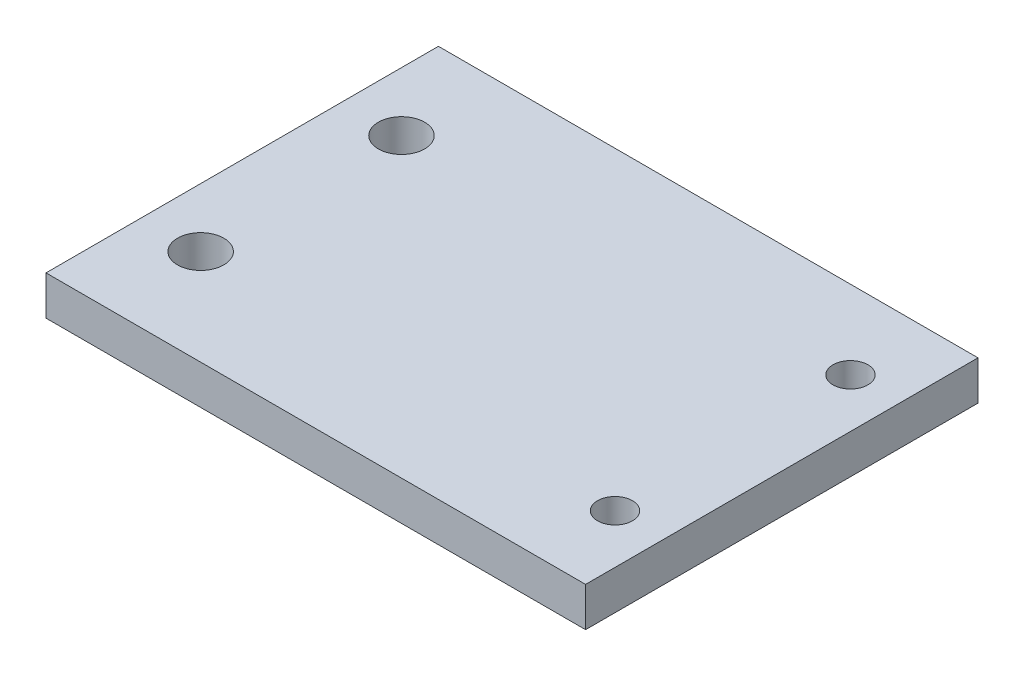
ISO-10303-21;
HEADER;
FILE_DESCRIPTION(('STEP AP214'),'2;1');
FILE_NAME('part.step','',(''),(''),'','','');
FILE_SCHEMA(('AUTOMOTIVE_DESIGN { 1 0 10303 214 1 1 1 1 }'));
ENDSEC;
DATA;
#1=APPLICATION_CONTEXT('core data for automotive mechanical design processes');
#2=APPLICATION_PROTOCOL_DEFINITION('international standard','automotive_design',2000,#1);
#3=PRODUCT_CONTEXT('',#1,'mechanical');
#4=PRODUCT('Part','Part','',(#3));
#5=PRODUCT_RELATED_PRODUCT_CATEGORY('part','',(#4));
#6=PRODUCT_DEFINITION_FORMATION('','',#4);
#7=PRODUCT_DEFINITION_CONTEXT('part definition',#1,'design');
#8=PRODUCT_DEFINITION('design','',#6,#7);
#9=PRODUCT_DEFINITION_SHAPE('','',#8);
#10=(LENGTH_UNIT() NAMED_UNIT(*) SI_UNIT(.MILLI.,.METRE.));
#11=(NAMED_UNIT(*) PLANE_ANGLE_UNIT() SI_UNIT($,.RADIAN.));
#12=(NAMED_UNIT(*) SI_UNIT($,.STERADIAN.) SOLID_ANGLE_UNIT());
#13=UNCERTAINTY_MEASURE_WITH_UNIT(LENGTH_MEASURE(1.E-05),#10,'distance_accuracy_value','');
#14=(GEOMETRIC_REPRESENTATION_CONTEXT(3) GLOBAL_UNCERTAINTY_ASSIGNED_CONTEXT((#13)) GLOBAL_UNIT_ASSIGNED_CONTEXT((#10,
#11,#12)) REPRESENTATION_CONTEXT('',''));
#15=CARTESIAN_POINT('',(0.,0.,0.));
#16=DIRECTION('',(0.,0.,1.));
#17=DIRECTION('',(1.,0.,0.));
#18=AXIS2_PLACEMENT_3D('',#15,#16,#17);
#19=CARTESIAN_POINT('',(0.,2.54,0.));
#20=DIRECTION('',(1.,0.,0.));
#21=DIRECTION('',(0.,0.,-1.));
#22=AXIS2_PLACEMENT_3D('',#19,#20,#21);
#23=PLANE('',#22);
#24=DIRECTION('',(0.,0.,1.));
#25=VECTOR('',#24,1.);
#26=CARTESIAN_POINT('',(0.,0.,0.));
#27=LINE('',#26,#25);
#28=CARTESIAN_POINT('',(0.,0.,-25.4));
#29=VERTEX_POINT('',#28);
#30=CARTESIAN_POINT('',(0.,0.,0.));
#31=VERTEX_POINT('',#30);
#32=EDGE_CURVE('E95',#29,#31,#27,.T.);
#33=ORIENTED_EDGE('',*,*,#32,.T.);
#34=DIRECTION('',(0.,-1.,0.));
#35=VECTOR('',#34,1.);
#36=CARTESIAN_POINT('',(0.,2.54,0.));
#37=LINE('',#36,#35);
#38=CARTESIAN_POINT('',(0.,2.54,0.));
#39=VERTEX_POINT('',#38);
#40=EDGE_CURVE('E11',#39,#31,#37,.T.);
#41=ORIENTED_EDGE('',*,*,#40,.F.);
#42=DIRECTION('',(0.,0.,1.));
#43=VECTOR('',#42,1.);
#44=CARTESIAN_POINT('',(0.,2.54,0.));
#45=LINE('',#44,#43);
#46=CARTESIAN_POINT('',(0.,2.54,-25.4));
#47=VERTEX_POINT('',#46);
#48=EDGE_CURVE('E83',#47,#39,#45,.T.);
#49=ORIENTED_EDGE('',*,*,#48,.F.);
#50=DIRECTION('',(0.,-1.,0.));
#51=VECTOR('',#50,1.);
#52=CARTESIAN_POINT('',(0.,2.54,-25.4));
#53=LINE('',#52,#51);
#54=EDGE_CURVE('E91',#47,#29,#53,.T.);
#55=ORIENTED_EDGE('',*,*,#54,.T.);
#56=EDGE_LOOP('',(#33,#41,#49,#55));
#57=FACE_BOUND('',#56,.T.);
#58=ADVANCED_FACE('F32',(#57),#23,.F.);
#59=CARTESIAN_POINT('',(0.,2.54,0.));
#60=DIRECTION('',(0.,0.,-1.));
#61=DIRECTION('',(-1.,0.,0.));
#62=AXIS2_PLACEMENT_3D('',#59,#60,#61);
#63=PLANE('',#62);
#64=DIRECTION('',(1.,0.,0.));
#65=VECTOR('',#64,1.);
#66=CARTESIAN_POINT('',(0.,0.,0.));
#67=LINE('',#66,#65);
#68=CARTESIAN_POINT('',(34.925,0.,0.));
#69=VERTEX_POINT('',#68);
#70=EDGE_CURVE('E87',#31,#69,#67,.T.);
#71=ORIENTED_EDGE('',*,*,#70,.T.);
#72=DIRECTION('',(0.,-1.,0.));
#73=VECTOR('',#72,1.);
#74=CARTESIAN_POINT('',(34.925,2.54,0.));
#75=LINE('',#74,#73);
#76=CARTESIAN_POINT('',(34.925,2.54,0.));
#77=VERTEX_POINT('',#76);
#78=EDGE_CURVE('E40',#77,#69,#75,.T.);
#79=ORIENTED_EDGE('',*,*,#78,.F.);
#80=DIRECTION('',(1.,0.,0.));
#81=VECTOR('',#80,1.);
#82=CARTESIAN_POINT('',(0.,2.54,0.));
#83=LINE('',#82,#81);
#84=EDGE_CURVE('E78',#39,#77,#83,.T.);
#85=ORIENTED_EDGE('',*,*,#84,.F.);
#86=ORIENTED_EDGE('',*,*,#40,.T.);
#87=EDGE_LOOP('',(#71,#79,#85,#86));
#88=FACE_BOUND('',#87,.T.);
#89=ADVANCED_FACE('F86',(#88),#63,.F.);
#90=CARTESIAN_POINT('',(34.925,2.54,0.));
#91=DIRECTION('',(-1.,0.,0.));
#92=DIRECTION('',(0.,0.,1.));
#93=AXIS2_PLACEMENT_3D('',#90,#91,#92);
#94=PLANE('',#93);
#95=DIRECTION('',(0.,0.,-1.));
#96=VECTOR('',#95,1.);
#97=CARTESIAN_POINT('',(34.925,0.,0.));
#98=LINE('',#97,#96);
#99=CARTESIAN_POINT('',(34.925,0.,-25.4));
#100=VERTEX_POINT('',#99);
#101=EDGE_CURVE('E65',#69,#100,#98,.T.);
#102=ORIENTED_EDGE('',*,*,#101,.T.);
#103=DIRECTION('',(0.,-1.,0.));
#104=VECTOR('',#103,1.);
#105=CARTESIAN_POINT('',(34.925,2.54,-25.4));
#106=LINE('',#105,#104);
#107=CARTESIAN_POINT('',(34.925,2.54,-25.4));
#108=VERTEX_POINT('',#107);
#109=EDGE_CURVE('E88',#108,#100,#106,.T.);
#110=ORIENTED_EDGE('',*,*,#109,.F.);
#111=DIRECTION('',(0.,0.,-1.));
#112=VECTOR('',#111,1.);
#113=CARTESIAN_POINT('',(34.925,2.54,0.));
#114=LINE('',#113,#112);
#115=EDGE_CURVE('E81',#77,#108,#114,.T.);
#116=ORIENTED_EDGE('',*,*,#115,.F.);
#117=ORIENTED_EDGE('',*,*,#78,.T.);
#118=EDGE_LOOP('',(#102,#110,#116,#117));
#119=FACE_BOUND('',#118,.T.);
#120=ADVANCED_FACE('F89',(#119),#94,.F.);
#121=CARTESIAN_POINT('',(0.,2.54,-25.4));
#122=DIRECTION('',(0.,0.,1.));
#123=DIRECTION('',(1.,0.,0.));
#124=AXIS2_PLACEMENT_3D('',#121,#122,#123);
#125=PLANE('',#124);
#126=DIRECTION('',(-1.,0.,0.));
#127=VECTOR('',#126,1.);
#128=CARTESIAN_POINT('',(0.,0.,-25.4));
#129=LINE('',#128,#127);
#130=EDGE_CURVE('E71',#100,#29,#129,.T.);
#131=ORIENTED_EDGE('',*,*,#130,.T.);
#132=ORIENTED_EDGE('',*,*,#54,.F.);
#133=DIRECTION('',(-1.,0.,0.));
#134=VECTOR('',#133,1.);
#135=CARTESIAN_POINT('',(0.,2.54,-25.4));
#136=LINE('',#135,#134);
#137=EDGE_CURVE('E48',#108,#47,#136,.T.);
#138=ORIENTED_EDGE('',*,*,#137,.F.);
#139=ORIENTED_EDGE('',*,*,#109,.T.);
#140=EDGE_LOOP('',(#131,#132,#138,#139));
#141=FACE_BOUND('',#140,.T.);
#142=ADVANCED_FACE('F103',(#141),#125,.F.);
#143=CARTESIAN_POINT('',(0.,2.54,0.));
#144=DIRECTION('',(0.,-1.,0.));
#145=DIRECTION('',(0.,0.,-1.));
#146=AXIS2_PLACEMENT_3D('',#143,#144,#145);
#147=PLANE('',#146);
#148=CARTESIAN_POINT('',(31.75,2.54,-20.32));
#149=DIRECTION('',(0.,1.,0.));
#150=DIRECTION('',(0.,0.,1.));
#151=AXIS2_PLACEMENT_3D('',#148,#149,#150);
#152=CIRCLE('',#151,1.1303);
#153=CARTESIAN_POINT('',(31.75,2.54,-19.1897));
#154=VERTEX_POINT('',#153);
#155=EDGE_CURVE('E127',#154,#154,#152,.T.);
#156=ORIENTED_EDGE('',*,*,#155,.F.);
#157=EDGE_LOOP('',(#156));
#158=FACE_BOUND('',#157,.T.);
#159=CARTESIAN_POINT('',(31.75,2.54,-5.08));
#160=DIRECTION('',(0.,1.,0.));
#161=DIRECTION('',(0.,0.,-1.));
#162=AXIS2_PLACEMENT_3D('',#159,#160,#161);
#163=CIRCLE('',#162,1.1303);
#164=CARTESIAN_POINT('',(31.75,2.54,-6.2103));
#165=VERTEX_POINT('',#164);
#166=EDGE_CURVE('E121',#165,#165,#163,.T.);
#167=ORIENTED_EDGE('',*,*,#166,.F.);
#168=EDGE_LOOP('',(#167));
#169=FACE_BOUND('',#168,.T.);
#170=CARTESIAN_POINT('',(3.81,2.54,-19.2));
#171=DIRECTION('',(0.,-1.,0.));
#172=DIRECTION('',(0.,0.,-1.));
#173=AXIS2_PLACEMENT_3D('',#170,#171,#172);
#174=CIRCLE('',#173,1.5);
#175=CARTESIAN_POINT('',(3.81,2.54,-20.7));
#176=VERTEX_POINT('',#175);
#177=EDGE_CURVE('E98',#176,#176,#174,.F.);
#178=ORIENTED_EDGE('',*,*,#177,.F.);
#179=EDGE_LOOP('',(#178));
#180=FACE_BOUND('',#179,.T.);
#181=CARTESIAN_POINT('',(3.81,2.54,-6.2));
#182=DIRECTION('',(0.,-1.,0.));
#183=DIRECTION('',(0.,0.,-1.));
#184=AXIS2_PLACEMENT_3D('',#181,#182,#183);
#185=CIRCLE('',#184,1.5);
#186=CARTESIAN_POINT('',(3.81,2.54,-7.7));
#187=VERTEX_POINT('',#186);
#188=EDGE_CURVE('E111',#187,#187,#185,.F.);
#189=ORIENTED_EDGE('',*,*,#188,.F.);
#190=EDGE_LOOP('',(#189));
#191=FACE_BOUND('',#190,.T.);
#192=ORIENTED_EDGE('',*,*,#48,.T.);
#193=ORIENTED_EDGE('',*,*,#84,.T.);
#194=ORIENTED_EDGE('',*,*,#115,.T.);
#195=ORIENTED_EDGE('',*,*,#137,.T.);
#196=EDGE_LOOP('',(#192,#193,#194,#195));
#197=FACE_BOUND('',#196,.T.);
#198=ADVANCED_FACE('F79',(#158,#169,#180,#191,#197),#147,.F.);
#199=CARTESIAN_POINT('',(0.,0.,0.));
#200=DIRECTION('',(0.,-1.,0.));
#201=DIRECTION('',(0.,0.,-1.));
#202=AXIS2_PLACEMENT_3D('',#199,#200,#201);
#203=PLANE('',#202);
#204=CARTESIAN_POINT('',(31.75,0.,-20.32));
#205=DIRECTION('',(0.,1.,0.));
#206=DIRECTION('',(0.,0.,1.));
#207=AXIS2_PLACEMENT_3D('',#204,#205,#206);
#208=CIRCLE('',#207,1.1303);
#209=CARTESIAN_POINT('',(31.75,0.,-19.1897));
#210=VERTEX_POINT('',#209);
#211=EDGE_CURVE('E118',#210,#210,#208,.T.);
#212=ORIENTED_EDGE('',*,*,#211,.T.);
#213=EDGE_LOOP('',(#212));
#214=FACE_BOUND('',#213,.T.);
#215=CARTESIAN_POINT('',(31.75,0.,-5.08));
#216=DIRECTION('',(0.,1.,0.));
#217=DIRECTION('',(0.,0.,-1.));
#218=AXIS2_PLACEMENT_3D('',#215,#216,#217);
#219=CIRCLE('',#218,1.1303);
#220=CARTESIAN_POINT('',(31.75,0.,-6.2103));
#221=VERTEX_POINT('',#220);
#222=EDGE_CURVE('E124',#221,#221,#219,.T.);
#223=ORIENTED_EDGE('',*,*,#222,.T.);
#224=EDGE_LOOP('',(#223));
#225=FACE_BOUND('',#224,.T.);
#226=CARTESIAN_POINT('',(3.81,0.,-19.2));
#227=DIRECTION('',(0.,1.,0.));
#228=DIRECTION('',(0.,0.,1.));
#229=AXIS2_PLACEMENT_3D('',#226,#227,#228);
#230=CIRCLE('',#229,1.5);
#231=CARTESIAN_POINT('',(3.81,0.,-20.7));
#232=VERTEX_POINT('',#231);
#233=EDGE_CURVE('E114',#232,#232,#230,.T.);
#234=ORIENTED_EDGE('',*,*,#233,.T.);
#235=EDGE_LOOP('',(#234));
#236=FACE_BOUND('',#235,.T.);
#237=CARTESIAN_POINT('',(3.81,0.,-6.2));
#238=DIRECTION('',(0.,1.,0.));
#239=DIRECTION('',(0.,0.,-1.));
#240=AXIS2_PLACEMENT_3D('',#237,#238,#239);
#241=CIRCLE('',#240,1.5);
#242=CARTESIAN_POINT('',(3.81,0.,-7.7));
#243=VERTEX_POINT('',#242);
#244=EDGE_CURVE('E115',#243,#243,#241,.T.);
#245=ORIENTED_EDGE('',*,*,#244,.T.);
#246=EDGE_LOOP('',(#245));
#247=FACE_BOUND('',#246,.T.);
#248=ORIENTED_EDGE('',*,*,#32,.F.);
#249=ORIENTED_EDGE('',*,*,#130,.F.);
#250=ORIENTED_EDGE('',*,*,#101,.F.);
#251=ORIENTED_EDGE('',*,*,#70,.F.);
#252=EDGE_LOOP('',(#248,#249,#250,#251));
#253=FACE_BOUND('',#252,.T.);
#254=ADVANCED_FACE('F106',(#214,#225,#236,#247,#253),#203,.T.);
#255=CARTESIAN_POINT('',(3.81,2.540012,-6.2));
#256=DIRECTION('',(0.,-1.,0.));
#257=DIRECTION('',(0.,0.,-1.));
#258=AXIS2_PLACEMENT_3D('',#255,#256,#257);
#259=CYLINDRICAL_SURFACE('',#258,1.5);
#260=CARTESIAN_POINT('',(3.81,0.,-7.7));
#261=CARTESIAN_POINT('',(3.81,0.0264583333333329,-7.7));
#262=CARTESIAN_POINT('',(3.81,0.0529166666666662,-7.7));
#263=CARTESIAN_POINT('',(3.81,0.105833333333333,-7.7));
#264=CARTESIAN_POINT('',(3.81,0.132291666666666,-7.7));
#265=CARTESIAN_POINT('',(3.81,0.185208333333333,-7.7));
#266=CARTESIAN_POINT('',(3.81,0.211666666666666,-7.7));
#267=CARTESIAN_POINT('',(3.81,0.264583333333333,-7.7));
#268=CARTESIAN_POINT('',(3.81,0.291041666666666,-7.7));
#269=CARTESIAN_POINT('',(3.81,0.343958333333333,-7.7));
#270=CARTESIAN_POINT('',(3.81,0.370416666666666,-7.7));
#271=CARTESIAN_POINT('',(3.81,0.423333333333333,-7.7));
#272=CARTESIAN_POINT('',(3.81,0.449791666666666,-7.7));
#273=CARTESIAN_POINT('',(3.81,0.502708333333333,-7.7));
#274=CARTESIAN_POINT('',(3.81,0.529166666666666,-7.7));
#275=CARTESIAN_POINT('',(3.81,0.582083333333333,-7.7));
#276=CARTESIAN_POINT('',(3.81,0.608541666666666,-7.7));
#277=CARTESIAN_POINT('',(3.81,0.661458333333333,-7.7));
#278=CARTESIAN_POINT('',(3.81,0.687916666666666,-7.7));
#279=CARTESIAN_POINT('',(3.81,0.740833333333333,-7.7));
#280=CARTESIAN_POINT('',(3.81,0.767291666666666,-7.7));
#281=CARTESIAN_POINT('',(3.81,0.820208333333333,-7.7));
#282=CARTESIAN_POINT('',(3.81,0.846666666666666,-7.7));
#283=CARTESIAN_POINT('',(3.81,0.899583333333333,-7.7));
#284=CARTESIAN_POINT('',(3.81,0.926041666666666,-7.7));
#285=CARTESIAN_POINT('',(3.81,0.978958333333333,-7.7));
#286=CARTESIAN_POINT('',(3.81,1.00541666666667,-7.7));
#287=CARTESIAN_POINT('',(3.81,1.05833333333333,-7.7));
#288=CARTESIAN_POINT('',(3.81,1.08479166666667,-7.7));
#289=CARTESIAN_POINT('',(3.81,1.13770833333333,-7.7));
#290=CARTESIAN_POINT('',(3.81,1.16416666666667,-7.7));
#291=CARTESIAN_POINT('',(3.81,1.21708333333333,-7.7));
#292=CARTESIAN_POINT('',(3.81,1.24354166666667,-7.7));
#293=CARTESIAN_POINT('',(3.81,1.29645833333333,-7.7));
#294=CARTESIAN_POINT('',(3.81,1.32291666666667,-7.7));
#295=CARTESIAN_POINT('',(3.81,1.37583333333333,-7.7));
#296=CARTESIAN_POINT('',(3.81,1.40229166666667,-7.7));
#297=CARTESIAN_POINT('',(3.81,1.45520833333333,-7.7));
#298=CARTESIAN_POINT('',(3.81,1.48166666666667,-7.7));
#299=CARTESIAN_POINT('',(3.81,1.53458333333333,-7.7));
#300=CARTESIAN_POINT('',(3.81,1.56104166666667,-7.7));
#301=CARTESIAN_POINT('',(3.81,1.61395833333333,-7.7));
#302=CARTESIAN_POINT('',(3.81,1.64041666666667,-7.7));
#303=CARTESIAN_POINT('',(3.81,1.69333333333333,-7.7));
#304=CARTESIAN_POINT('',(3.81,1.71979166666667,-7.7));
#305=CARTESIAN_POINT('',(3.81,1.77270833333333,-7.7));
#306=CARTESIAN_POINT('',(3.81,1.79916666666667,-7.7));
#307=CARTESIAN_POINT('',(3.81,1.85208333333333,-7.7));
#308=CARTESIAN_POINT('',(3.81,1.87854166666667,-7.7));
#309=CARTESIAN_POINT('',(3.81,1.93145833333333,-7.7));
#310=CARTESIAN_POINT('',(3.81,1.95791666666667,-7.7));
#311=CARTESIAN_POINT('',(3.81,2.01083333333333,-7.7));
#312=CARTESIAN_POINT('',(3.81,2.03729166666667,-7.7));
#313=CARTESIAN_POINT('',(3.81,2.09020833333333,-7.7));
#314=CARTESIAN_POINT('',(3.81,2.11666666666667,-7.7));
#315=CARTESIAN_POINT('',(3.81,2.16958333333333,-7.7));
#316=CARTESIAN_POINT('',(3.81,2.19604166666667,-7.7));
#317=CARTESIAN_POINT('',(3.81,2.24895833333333,-7.7));
#318=CARTESIAN_POINT('',(3.81,2.27541666666667,-7.7));
#319=CARTESIAN_POINT('',(3.81,2.32833333333333,-7.7));
#320=CARTESIAN_POINT('',(3.81,2.35479166666667,-7.7));
#321=CARTESIAN_POINT('',(3.81,2.40770833333333,-7.7));
#322=CARTESIAN_POINT('',(3.81,2.43416666666667,-7.7));
#323=CARTESIAN_POINT('',(3.81,2.48708333333333,-7.7));
#324=CARTESIAN_POINT('',(3.81,2.51354166666667,-7.7));
#325=CARTESIAN_POINT('',(3.81,2.54,-7.7));
#326=B_SPLINE_CURVE_WITH_KNOTS('',3,(#260,#261,#262,#263,#264,#265,#266,#267,#268,#269,#270,
#271,#272,#273,#274,#275,#276,#277,#278,#279,#280,#281,#282,#283,#284,#285,#286,#287,#288,#289,
#290,#291,#292,#293,#294,#295,#296,#297,#298,#299,#300,#301,#302,#303,#304,#305,#306,#307,#308,
#309,#310,#311,#312,#313,#314,#315,#316,#317,#318,#319,#320,#321,#322,#323,#324,#325),
.UNSPECIFIED.,.F.,.F.,(4,2,2,2,2,2,2,2,2,2,2,2,2,2,2,2,2,2,2,2,2,2,2,2,2,2,2,2,2,2,2,2,4),(0.,
0.079375,0.15875,0.238125,0.3175,0.396875,0.47625,0.555625,0.635,0.714375,0.79375,0.873125,
0.9525,1.031875,1.11125,1.190625,1.27,1.349375,1.42875,1.508125,1.5875,1.666875,1.74625,
1.825625,1.905,1.984375,2.06375,2.143125,2.2225,2.301875,2.38125,2.460625,2.54),.UNSPECIFIED.);
#327=EDGE_CURVE('BSEAM151',#243,#187,#326,.T.);
#328=ORIENTED_EDGE('',*,*,#244,.F.);
#329=ORIENTED_EDGE('',*,*,#188,.T.);
#330=ORIENTED_EDGE('',*,*,#327,.T.);
#331=ORIENTED_EDGE('',*,*,#327,.F.);
#332=EDGE_LOOP('',(#328,#330,#329,#331));
#333=FACE_BOUND('',#332,.T.);
#334=ADVANCED_FACE('F151',(#333),#259,.F.);
#335=CARTESIAN_POINT('',(3.81,2.540012,-19.2));
#336=DIRECTION('',(0.,-1.,0.));
#337=DIRECTION('',(0.,0.,-1.));
#338=AXIS2_PLACEMENT_3D('',#335,#336,#337);
#339=CYLINDRICAL_SURFACE('',#338,1.5);
#340=CARTESIAN_POINT('',(3.81,0.,-20.7));
#341=CARTESIAN_POINT('',(3.81,0.0264583333333329,-20.7));
#342=CARTESIAN_POINT('',(3.81,0.0529166666666662,-20.7));
#343=CARTESIAN_POINT('',(3.81,0.105833333333333,-20.7));
#344=CARTESIAN_POINT('',(3.81,0.132291666666666,-20.7));
#345=CARTESIAN_POINT('',(3.81,0.185208333333333,-20.7));
#346=CARTESIAN_POINT('',(3.81,0.211666666666666,-20.7));
#347=CARTESIAN_POINT('',(3.81,0.264583333333333,-20.7));
#348=CARTESIAN_POINT('',(3.81,0.291041666666666,-20.7));
#349=CARTESIAN_POINT('',(3.81,0.343958333333333,-20.7));
#350=CARTESIAN_POINT('',(3.81,0.370416666666666,-20.7));
#351=CARTESIAN_POINT('',(3.81,0.423333333333333,-20.7));
#352=CARTESIAN_POINT('',(3.81,0.449791666666666,-20.7));
#353=CARTESIAN_POINT('',(3.81,0.502708333333333,-20.7));
#354=CARTESIAN_POINT('',(3.81,0.529166666666666,-20.7));
#355=CARTESIAN_POINT('',(3.81,0.582083333333333,-20.7));
#356=CARTESIAN_POINT('',(3.81,0.608541666666666,-20.7));
#357=CARTESIAN_POINT('',(3.81,0.661458333333333,-20.7));
#358=CARTESIAN_POINT('',(3.81,0.687916666666666,-20.7));
#359=CARTESIAN_POINT('',(3.81,0.740833333333333,-20.7));
#360=CARTESIAN_POINT('',(3.81,0.767291666666666,-20.7));
#361=CARTESIAN_POINT('',(3.81,0.820208333333333,-20.7));
#362=CARTESIAN_POINT('',(3.81,0.846666666666666,-20.7));
#363=CARTESIAN_POINT('',(3.81,0.899583333333333,-20.7));
#364=CARTESIAN_POINT('',(3.81,0.926041666666666,-20.7));
#365=CARTESIAN_POINT('',(3.81,0.978958333333333,-20.7));
#366=CARTESIAN_POINT('',(3.81,1.00541666666667,-20.7));
#367=CARTESIAN_POINT('',(3.81,1.05833333333333,-20.7));
#368=CARTESIAN_POINT('',(3.81,1.08479166666667,-20.7));
#369=CARTESIAN_POINT('',(3.81,1.13770833333333,-20.7));
#370=CARTESIAN_POINT('',(3.81,1.16416666666667,-20.7));
#371=CARTESIAN_POINT('',(3.81,1.21708333333333,-20.7));
#372=CARTESIAN_POINT('',(3.81,1.24354166666667,-20.7));
#373=CARTESIAN_POINT('',(3.81,1.29645833333333,-20.7));
#374=CARTESIAN_POINT('',(3.81,1.32291666666667,-20.7));
#375=CARTESIAN_POINT('',(3.81,1.37583333333333,-20.7));
#376=CARTESIAN_POINT('',(3.81,1.40229166666667,-20.7));
#377=CARTESIAN_POINT('',(3.81,1.45520833333333,-20.7));
#378=CARTESIAN_POINT('',(3.81,1.48166666666667,-20.7));
#379=CARTESIAN_POINT('',(3.81,1.53458333333333,-20.7));
#380=CARTESIAN_POINT('',(3.81,1.56104166666667,-20.7));
#381=CARTESIAN_POINT('',(3.81,1.61395833333333,-20.7));
#382=CARTESIAN_POINT('',(3.81,1.64041666666667,-20.7));
#383=CARTESIAN_POINT('',(3.81,1.69333333333333,-20.7));
#384=CARTESIAN_POINT('',(3.81,1.71979166666667,-20.7));
#385=CARTESIAN_POINT('',(3.81,1.77270833333333,-20.7));
#386=CARTESIAN_POINT('',(3.81,1.79916666666667,-20.7));
#387=CARTESIAN_POINT('',(3.81,1.85208333333333,-20.7));
#388=CARTESIAN_POINT('',(3.81,1.87854166666667,-20.7));
#389=CARTESIAN_POINT('',(3.81,1.93145833333333,-20.7));
#390=CARTESIAN_POINT('',(3.81,1.95791666666667,-20.7));
#391=CARTESIAN_POINT('',(3.81,2.01083333333333,-20.7));
#392=CARTESIAN_POINT('',(3.81,2.03729166666667,-20.7));
#393=CARTESIAN_POINT('',(3.81,2.09020833333333,-20.7));
#394=CARTESIAN_POINT('',(3.81,2.11666666666667,-20.7));
#395=CARTESIAN_POINT('',(3.81,2.16958333333333,-20.7));
#396=CARTESIAN_POINT('',(3.81,2.19604166666667,-20.7));
#397=CARTESIAN_POINT('',(3.81,2.24895833333333,-20.7));
#398=CARTESIAN_POINT('',(3.81,2.27541666666667,-20.7));
#399=CARTESIAN_POINT('',(3.81,2.32833333333333,-20.7));
#400=CARTESIAN_POINT('',(3.81,2.35479166666667,-20.7));
#401=CARTESIAN_POINT('',(3.81,2.40770833333333,-20.7));
#402=CARTESIAN_POINT('',(3.81,2.43416666666667,-20.7));
#403=CARTESIAN_POINT('',(3.81,2.48708333333333,-20.7));
#404=CARTESIAN_POINT('',(3.81,2.51354166666667,-20.7));
#405=CARTESIAN_POINT('',(3.81,2.54,-20.7));
#406=B_SPLINE_CURVE_WITH_KNOTS('',3,(#340,#341,#342,#343,#344,#345,#346,#347,#348,#349,#350,
#351,#352,#353,#354,#355,#356,#357,#358,#359,#360,#361,#362,#363,#364,#365,#366,#367,#368,#369,
#370,#371,#372,#373,#374,#375,#376,#377,#378,#379,#380,#381,#382,#383,#384,#385,#386,#387,#388,
#389,#390,#391,#392,#393,#394,#395,#396,#397,#398,#399,#400,#401,#402,#403,#404,#405),
.UNSPECIFIED.,.F.,.F.,(4,2,2,2,2,2,2,2,2,2,2,2,2,2,2,2,2,2,2,2,2,2,2,2,2,2,2,2,2,2,2,2,4),(0.,
0.079375,0.15875,0.238125,0.3175,0.396875,0.47625,0.555625,0.635,0.714375,0.79375,0.873125,
0.9525,1.031875,1.11125,1.190625,1.27,1.349375,1.42875,1.508125,1.5875,1.666875,1.74625,
1.825625,1.905,1.984375,2.06375,2.143125,2.2225,2.301875,2.38125,2.460625,2.54),.UNSPECIFIED.);
#407=EDGE_CURVE('BSEAM153',#232,#176,#406,.T.);
#408=ORIENTED_EDGE('',*,*,#233,.F.);
#409=ORIENTED_EDGE('',*,*,#177,.T.);
#410=ORIENTED_EDGE('',*,*,#407,.T.);
#411=ORIENTED_EDGE('',*,*,#407,.F.);
#412=EDGE_LOOP('',(#408,#410,#409,#411));
#413=FACE_BOUND('',#412,.T.);
#414=ADVANCED_FACE('F153',(#413),#339,.F.);
#415=CARTESIAN_POINT('',(31.75,0.,-5.08));
#416=DIRECTION('',(0.,1.,0.));
#417=DIRECTION('',(0.,0.,1.));
#418=AXIS2_PLACEMENT_3D('',#415,#416,#417);
#419=CYLINDRICAL_SURFACE('',#418,1.1303);
#420=ORIENTED_EDGE('',*,*,#222,.F.);
#421=EDGE_LOOP('',(#420));
#422=FACE_BOUND('',#421,.T.);
#423=ORIENTED_EDGE('',*,*,#166,.T.);
#424=EDGE_LOOP('',(#423));
#425=FACE_BOUND('',#424,.T.);
#426=ADVANCED_FACE('F138',(#422,#425),#419,.F.);
#427=CARTESIAN_POINT('',(31.75,0.,-20.32));
#428=DIRECTION('',(0.,1.,0.));
#429=DIRECTION('',(0.,0.,1.));
#430=AXIS2_PLACEMENT_3D('',#427,#428,#429);
#431=CYLINDRICAL_SURFACE('',#430,1.1303);
#432=ORIENTED_EDGE('',*,*,#211,.F.);
#433=EDGE_LOOP('',(#432));
#434=FACE_BOUND('',#433,.T.);
#435=ORIENTED_EDGE('',*,*,#155,.T.);
#436=EDGE_LOOP('',(#435));
#437=FACE_BOUND('',#436,.T.);
#438=ADVANCED_FACE('F135',(#434,#437),#431,.F.);
#439=CLOSED_SHELL('',(#58,#89,#120,#142,#198,#254,#334,#414,#426,#438));
#440=MANIFOLD_SOLID_BREP('B2',#439);
#441=ADVANCED_BREP_SHAPE_REPRESENTATION('',(#18,#440),#14);
#442=SHAPE_DEFINITION_REPRESENTATION(#9,#441);
ENDSEC;
END-ISO-10303-21;
